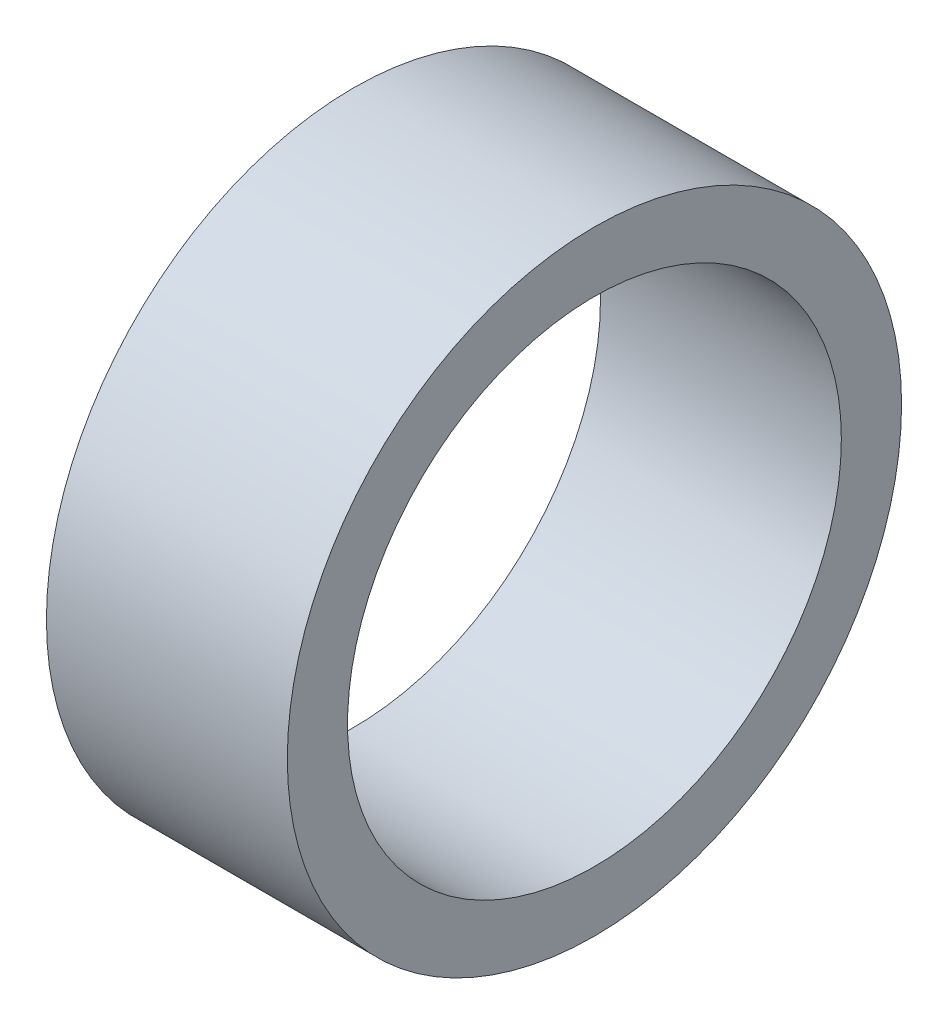
ISO-10303-21;
HEADER;
FILE_DESCRIPTION(('STEP AP214'),'2;1');
FILE_NAME('part.step','',(''),(''),'','','');
FILE_SCHEMA(('AUTOMOTIVE_DESIGN { 1 0 10303 214 1 1 1 1 }'));
ENDSEC;
DATA;
#1=APPLICATION_CONTEXT('core data for automotive mechanical design processes');
#2=APPLICATION_PROTOCOL_DEFINITION('international standard','automotive_design',2000,#1);
#3=PRODUCT_CONTEXT('',#1,'mechanical');
#4=PRODUCT('Part','Part','',(#3));
#5=PRODUCT_RELATED_PRODUCT_CATEGORY('part','',(#4));
#6=PRODUCT_DEFINITION_FORMATION('','',#4);
#7=PRODUCT_DEFINITION_CONTEXT('part definition',#1,'design');
#8=PRODUCT_DEFINITION('design','',#6,#7);
#9=PRODUCT_DEFINITION_SHAPE('','',#8);
#10=(LENGTH_UNIT() NAMED_UNIT(*) SI_UNIT(.MILLI.,.METRE.));
#11=(NAMED_UNIT(*) PLANE_ANGLE_UNIT() SI_UNIT($,.RADIAN.));
#12=(NAMED_UNIT(*) SI_UNIT($,.STERADIAN.) SOLID_ANGLE_UNIT());
#13=UNCERTAINTY_MEASURE_WITH_UNIT(LENGTH_MEASURE(1.E-05),#10,'distance_accuracy_value','');
#14=(GEOMETRIC_REPRESENTATION_CONTEXT(3) GLOBAL_UNCERTAINTY_ASSIGNED_CONTEXT((#13)) GLOBAL_UNIT_ASSIGNED_CONTEXT((#10,
#11,#12)) REPRESENTATION_CONTEXT('',''));
#15=CARTESIAN_POINT('',(0.,0.,0.));
#16=DIRECTION('',(0.,0.,1.));
#17=DIRECTION('',(1.,0.,0.));
#18=AXIS2_PLACEMENT_3D('',#15,#16,#17);
#19=CARTESIAN_POINT('',(2.,0.,0.));
#20=DIRECTION('',(1.,0.,0.));
#21=DIRECTION('',(0.,0.,-1.));
#22=AXIS2_PLACEMENT_3D('',#19,#20,#21);
#23=PLANE('',#22);
#24=CARTESIAN_POINT('',(2.,0.,0.));
#25=DIRECTION('',(1.,0.,0.));
#26=DIRECTION('',(0.,0.,-1.));
#27=AXIS2_PLACEMENT_3D('',#24,#25,#26);
#28=CIRCLE('',#27,2.55);
#29=CARTESIAN_POINT('',(2.,0.,-2.55));
#30=VERTEX_POINT('',#29);
#31=EDGE_CURVE('E10',#30,#30,#28,.T.);
#32=ORIENTED_EDGE('',*,*,#31,.T.);
#33=EDGE_LOOP('',(#32));
#34=FACE_BOUND('',#33,.T.);
#35=CARTESIAN_POINT('',(2.,0.,0.));
#36=DIRECTION('',(1.,0.,0.));
#37=DIRECTION('',(0.,0.,-1.));
#38=AXIS2_PLACEMENT_3D('',#35,#36,#37);
#39=CIRCLE('',#38,2.05);
#40=CARTESIAN_POINT('',(2.,0.,-2.05));
#41=VERTEX_POINT('',#40);
#42=EDGE_CURVE('E50',#41,#41,#39,.T.);
#43=ORIENTED_EDGE('',*,*,#42,.F.);
#44=EDGE_LOOP('',(#43));
#45=FACE_BOUND('',#44,.T.);
#46=ADVANCED_FACE('F39',(#34,#45),#23,.T.);
#47=CARTESIAN_POINT('',(0.,0.,0.));
#48=DIRECTION('',(1.,0.,0.));
#49=DIRECTION('',(0.,0.,-1.));
#50=AXIS2_PLACEMENT_3D('',#47,#48,#49);
#51=PLANE('',#50);
#52=CARTESIAN_POINT('',(0.,0.,0.));
#53=DIRECTION('',(1.,0.,0.));
#54=DIRECTION('',(0.,0.,-1.));
#55=AXIS2_PLACEMENT_3D('',#52,#53,#54);
#56=CIRCLE('',#55,2.55);
#57=CARTESIAN_POINT('',(0.,0.,-2.55));
#58=VERTEX_POINT('',#57);
#59=EDGE_CURVE('E43',#58,#58,#56,.T.);
#60=ORIENTED_EDGE('',*,*,#59,.F.);
#61=EDGE_LOOP('',(#60));
#62=FACE_BOUND('',#61,.T.);
#63=CARTESIAN_POINT('',(0.,0.,0.));
#64=DIRECTION('',(1.,0.,0.));
#65=DIRECTION('',(0.,0.,-1.));
#66=AXIS2_PLACEMENT_3D('',#63,#64,#65);
#67=CIRCLE('',#66,2.05);
#68=CARTESIAN_POINT('',(0.,0.,-2.05));
#69=VERTEX_POINT('',#68);
#70=EDGE_CURVE('E52',#69,#69,#67,.T.);
#71=ORIENTED_EDGE('',*,*,#70,.T.);
#72=EDGE_LOOP('',(#71));
#73=FACE_BOUND('',#72,.T.);
#74=ADVANCED_FACE('F62',(#62,#73),#51,.F.);
#75=CARTESIAN_POINT('',(2.,0.,0.));
#76=DIRECTION('',(-1.,0.,0.));
#77=DIRECTION('',(0.,0.,1.));
#78=AXIS2_PLACEMENT_3D('',#75,#76,#77);
#79=CYLINDRICAL_SURFACE('',#78,2.55);
#80=ORIENTED_EDGE('',*,*,#31,.F.);
#81=EDGE_LOOP('',(#80));
#82=FACE_BOUND('',#81,.T.);
#83=ORIENTED_EDGE('',*,*,#59,.T.);
#84=EDGE_LOOP('',(#83));
#85=FACE_BOUND('',#84,.T.);
#86=ADVANCED_FACE('F41',(#82,#85),#79,.T.);
#87=CARTESIAN_POINT('',(2.,0.,0.));
#88=DIRECTION('',(-1.,0.,0.));
#89=DIRECTION('',(0.,0.,1.));
#90=AXIS2_PLACEMENT_3D('',#87,#88,#89);
#91=CYLINDRICAL_SURFACE('',#90,2.05);
#92=ORIENTED_EDGE('',*,*,#42,.T.);
#93=EDGE_LOOP('',(#92));
#94=FACE_BOUND('',#93,.T.);
#95=ORIENTED_EDGE('',*,*,#70,.F.);
#96=EDGE_LOOP('',(#95));
#97=FACE_BOUND('',#96,.T.);
#98=ADVANCED_FACE('F58',(#94,#97),#91,.F.);
#99=CLOSED_SHELL('',(#46,#74,#86,#98));
#100=MANIFOLD_SOLID_BREP('B2',#99);
#101=ADVANCED_BREP_SHAPE_REPRESENTATION('',(#18,#100),#14);
#102=SHAPE_DEFINITION_REPRESENTATION(#9,#101);
ENDSEC;
END-ISO-10303-21;
